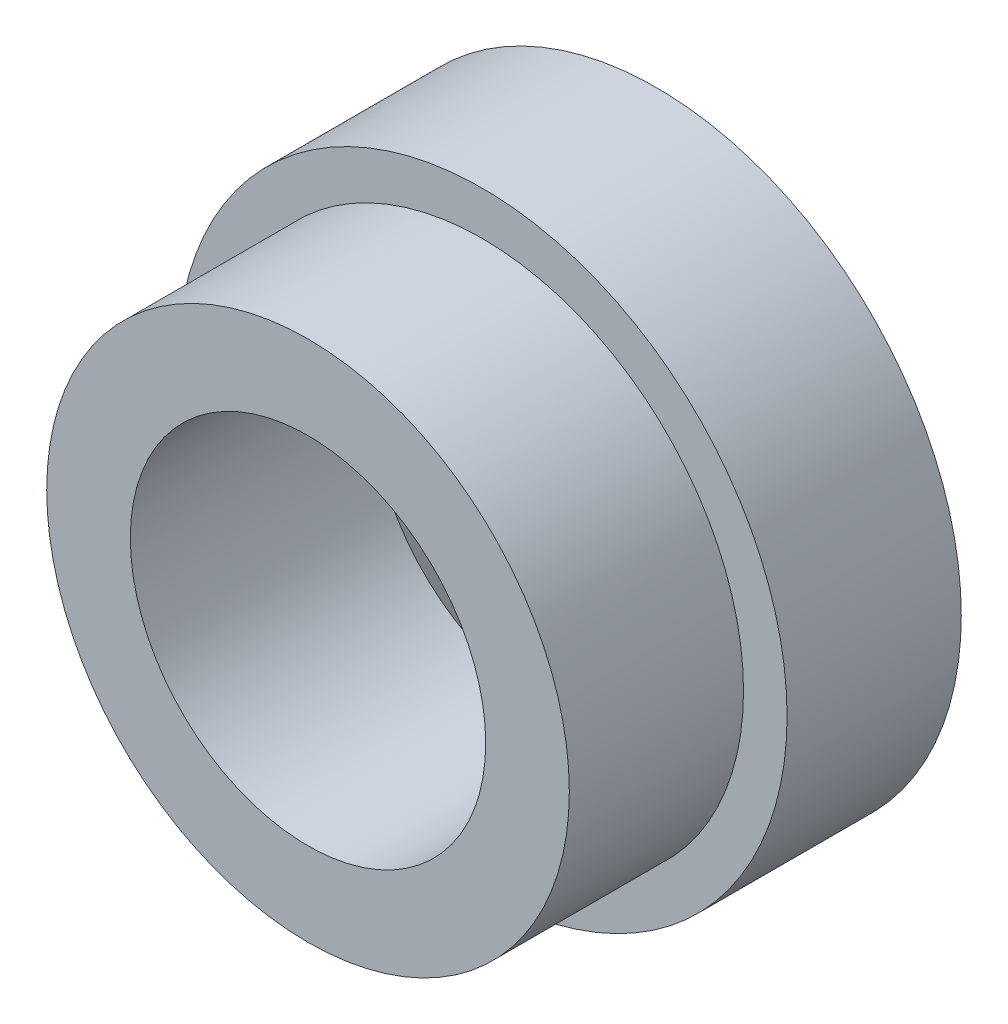
ISO-10303-21;
HEADER;
FILE_DESCRIPTION(('STEP AP214'),'2;1');
FILE_NAME('part.step','',(''),(''),'','','');
FILE_SCHEMA(('AUTOMOTIVE_DESIGN { 1 0 10303 214 1 1 1 1 }'));
ENDSEC;
DATA;
#1=APPLICATION_CONTEXT('core data for automotive mechanical design processes');
#2=APPLICATION_PROTOCOL_DEFINITION('international standard','automotive_design',2000,#1);
#3=PRODUCT_CONTEXT('',#1,'mechanical');
#4=PRODUCT('Part','Part','',(#3));
#5=PRODUCT_RELATED_PRODUCT_CATEGORY('part','',(#4));
#6=PRODUCT_DEFINITION_FORMATION('','',#4);
#7=PRODUCT_DEFINITION_CONTEXT('part definition',#1,'design');
#8=PRODUCT_DEFINITION('design','',#6,#7);
#9=PRODUCT_DEFINITION_SHAPE('','',#8);
#10=(LENGTH_UNIT() NAMED_UNIT(*) SI_UNIT(.MILLI.,.METRE.));
#11=(NAMED_UNIT(*) PLANE_ANGLE_UNIT() SI_UNIT($,.RADIAN.));
#12=(NAMED_UNIT(*) SI_UNIT($,.STERADIAN.) SOLID_ANGLE_UNIT());
#13=UNCERTAINTY_MEASURE_WITH_UNIT(LENGTH_MEASURE(1.E-05),#10,'distance_accuracy_value','');
#14=(GEOMETRIC_REPRESENTATION_CONTEXT(3) GLOBAL_UNCERTAINTY_ASSIGNED_CONTEXT((#13)) GLOBAL_UNIT_ASSIGNED_CONTEXT((#10,
#11,#12)) REPRESENTATION_CONTEXT('',''));
#15=CARTESIAN_POINT('',(0.,0.,0.));
#16=DIRECTION('',(0.,0.,1.));
#17=DIRECTION('',(1.,0.,0.));
#18=AXIS2_PLACEMENT_3D('',#15,#16,#17);
#19=CARTESIAN_POINT('',(0.,0.,3.175));
#20=DIRECTION('',(0.,0.,-1.));
#21=DIRECTION('',(-1.,0.,0.));
#22=AXIS2_PLACEMENT_3D('',#19,#20,#21);
#23=CYLINDRICAL_SURFACE('',#22,5.55625);
#24=CARTESIAN_POINT('',(0.,0.,3.175));
#25=DIRECTION('',(0.,0.,1.));
#26=DIRECTION('',(1.,0.,0.));
#27=AXIS2_PLACEMENT_3D('',#24,#25,#26);
#28=CIRCLE('',#27,5.55625);
#29=CARTESIAN_POINT('',(5.55625,0.,3.175));
#30=VERTEX_POINT('',#29);
#31=EDGE_CURVE('E40',#30,#30,#28,.T.);
#32=ORIENTED_EDGE('',*,*,#31,.F.);
#33=EDGE_LOOP('',(#32));
#34=FACE_BOUND('',#33,.T.);
#35=CARTESIAN_POINT('',(0.,0.,0.));
#36=DIRECTION('',(0.,0.,-1.));
#37=DIRECTION('',(-1.,0.,0.));
#38=AXIS2_PLACEMENT_3D('',#35,#36,#37);
#39=CIRCLE('',#38,5.55625);
#40=CARTESIAN_POINT('',(-5.55625,0.,0.));
#41=VERTEX_POINT('',#40);
#42=EDGE_CURVE('E62',#41,#41,#39,.T.);
#43=ORIENTED_EDGE('',*,*,#42,.F.);
#44=EDGE_LOOP('',(#43));
#45=FACE_BOUND('',#44,.T.);
#46=ADVANCED_FACE('F37',(#34,#45),#23,.T.);
#47=CARTESIAN_POINT('',(0.,0.,3.175));
#48=DIRECTION('',(0.,0.,1.));
#49=DIRECTION('',(1.,0.,0.));
#50=AXIS2_PLACEMENT_3D('',#47,#48,#49);
#51=PLANE('',#50);
#52=CARTESIAN_POINT('',(0.,0.,3.175));
#53=DIRECTION('',(0.,0.,1.));
#54=DIRECTION('',(1.,0.,0.));
#55=AXIS2_PLACEMENT_3D('',#52,#53,#54);
#56=CIRCLE('',#55,4.7625);
#57=CARTESIAN_POINT('',(4.7625,0.,3.175));
#58=VERTEX_POINT('',#57);
#59=EDGE_CURVE('E10',#58,#58,#56,.T.);
#60=ORIENTED_EDGE('',*,*,#59,.F.);
#61=EDGE_LOOP('',(#60));
#62=FACE_BOUND('',#61,.T.);
#63=ORIENTED_EDGE('',*,*,#31,.T.);
#64=EDGE_LOOP('',(#63));
#65=FACE_BOUND('',#64,.T.);
#66=ADVANCED_FACE('F70',(#62,#65),#51,.T.);
#67=CARTESIAN_POINT('',(0.,0.,6.35));
#68=DIRECTION('',(0.,0.,-1.));
#69=DIRECTION('',(-1.,0.,0.));
#70=AXIS2_PLACEMENT_3D('',#67,#68,#69);
#71=CYLINDRICAL_SURFACE('',#70,4.7625);
#72=CARTESIAN_POINT('',(0.,0.,6.35));
#73=DIRECTION('',(0.,0.,1.));
#74=DIRECTION('',(1.,0.,0.));
#75=AXIS2_PLACEMENT_3D('',#72,#73,#74);
#76=CIRCLE('',#75,4.7625);
#77=CARTESIAN_POINT('',(4.7625,0.,6.35));
#78=VERTEX_POINT('',#77);
#79=EDGE_CURVE('E49',#78,#78,#76,.T.);
#80=ORIENTED_EDGE('',*,*,#79,.F.);
#81=EDGE_LOOP('',(#80));
#82=FACE_BOUND('',#81,.T.);
#83=ORIENTED_EDGE('',*,*,#59,.T.);
#84=EDGE_LOOP('',(#83));
#85=FACE_BOUND('',#84,.T.);
#86=ADVANCED_FACE('F75',(#82,#85),#71,.T.);
#87=CARTESIAN_POINT('',(0.,0.,6.35));
#88=DIRECTION('',(0.,0.,1.));
#89=DIRECTION('',(1.,0.,0.));
#90=AXIS2_PLACEMENT_3D('',#87,#88,#89);
#91=PLANE('',#90);
#92=CARTESIAN_POINT('',(0.,0.,6.35));
#93=DIRECTION('',(0.,0.,1.));
#94=DIRECTION('',(1.,0.,0.));
#95=AXIS2_PLACEMENT_3D('',#92,#93,#94);
#96=CIRCLE('',#95,3.2385);
#97=CARTESIAN_POINT('',(3.2385,0.,6.35));
#98=VERTEX_POINT('',#97);
#99=EDGE_CURVE('E54',#98,#98,#96,.T.);
#100=ORIENTED_EDGE('',*,*,#99,.F.);
#101=EDGE_LOOP('',(#100));
#102=FACE_BOUND('',#101,.T.);
#103=ORIENTED_EDGE('',*,*,#79,.T.);
#104=EDGE_LOOP('',(#103));
#105=FACE_BOUND('',#104,.T.);
#106=ADVANCED_FACE('F82',(#102,#105),#91,.T.);
#107=CARTESIAN_POINT('',(0.,0.,0.));
#108=DIRECTION('',(0.,0.,-1.));
#109=DIRECTION('',(-1.,0.,0.));
#110=AXIS2_PLACEMENT_3D('',#107,#108,#109);
#111=CYLINDRICAL_SURFACE('',#110,3.2385);
#112=CARTESIAN_POINT('',(0.,0.,1.94482317016114));
#113=DIRECTION('',(0.,0.,-1.));
#114=DIRECTION('',(-1.,0.,0.));
#115=AXIS2_PLACEMENT_3D('',#112,#113,#114);
#116=CIRCLE('',#115,3.2385);
#117=CARTESIAN_POINT('',(-3.2385,0.,1.94482317016114));
#118=VERTEX_POINT('',#117);
#119=EDGE_CURVE('E58',#118,#118,#116,.T.);
#120=ORIENTED_EDGE('',*,*,#119,.T.);
#121=EDGE_LOOP('',(#120));
#122=FACE_BOUND('',#121,.T.);
#123=ORIENTED_EDGE('',*,*,#99,.T.);
#124=EDGE_LOOP('',(#123));
#125=FACE_BOUND('',#124,.T.);
#126=ADVANCED_FACE('F88',(#122,#125),#111,.F.);
#127=CARTESIAN_POINT('',(0.,0.,0.));
#128=DIRECTION('',(0.,0.,-1.));
#129=DIRECTION('',(-1.,0.,0.));
#130=AXIS2_PLACEMENT_3D('',#127,#128,#129);
#131=CONICAL_SURFACE('',#130,5.55625,0.872664625997164);
#132=ORIENTED_EDGE('',*,*,#119,.F.);
#133=EDGE_LOOP('',(#132));
#134=FACE_BOUND('',#133,.T.);
#135=ORIENTED_EDGE('',*,*,#42,.T.);
#136=EDGE_LOOP('',(#135));
#137=FACE_BOUND('',#136,.T.);
#138=ADVANCED_FACE('F67',(#134,#137),#131,.F.);
#139=CLOSED_SHELL('',(#46,#66,#86,#106,#126,#138));
#140=MANIFOLD_SOLID_BREP('B2',#139);
#141=ADVANCED_BREP_SHAPE_REPRESENTATION('',(#18,#140),#14);
#142=SHAPE_DEFINITION_REPRESENTATION(#9,#141);
ENDSEC;
END-ISO-10303-21;
